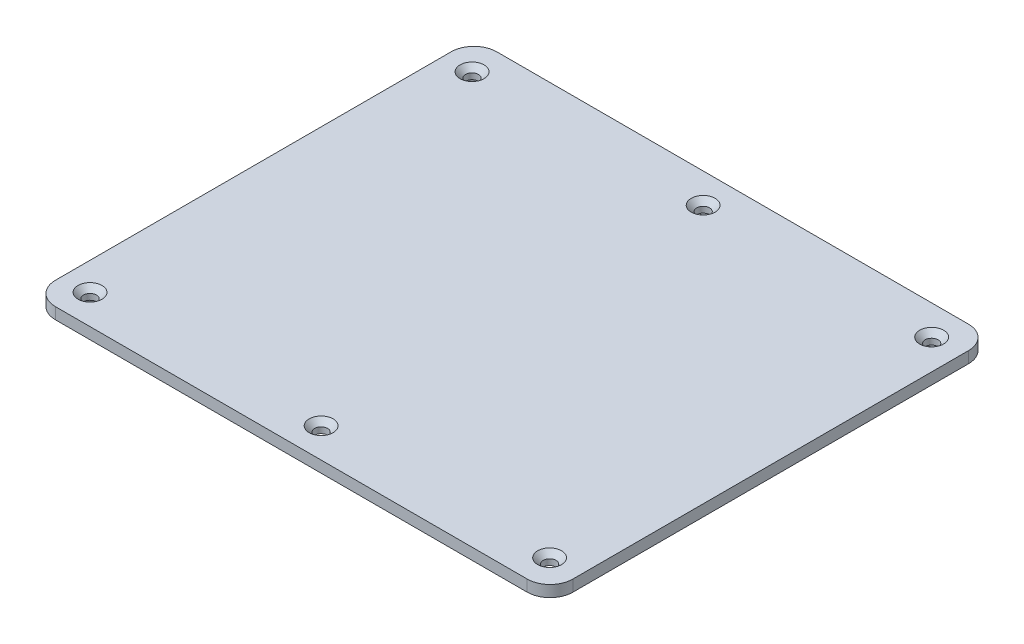
ISO-10303-21;
HEADER;
FILE_DESCRIPTION(('STEP AP214'),'2;1');
FILE_NAME('part.step','',(''),(''),'','','');
FILE_SCHEMA(('AUTOMOTIVE_DESIGN { 1 0 10303 214 1 1 1 1 }'));
ENDSEC;
DATA;
#1=APPLICATION_CONTEXT('core data for automotive mechanical design processes');
#2=APPLICATION_PROTOCOL_DEFINITION('international standard','automotive_design',2000,#1);
#3=PRODUCT_CONTEXT('',#1,'mechanical');
#4=PRODUCT('Part','Part','',(#3));
#5=PRODUCT_RELATED_PRODUCT_CATEGORY('part','',(#4));
#6=PRODUCT_DEFINITION_FORMATION('','',#4);
#7=PRODUCT_DEFINITION_CONTEXT('part definition',#1,'design');
#8=PRODUCT_DEFINITION('design','',#6,#7);
#9=PRODUCT_DEFINITION_SHAPE('','',#8);
#10=(LENGTH_UNIT() NAMED_UNIT(*) SI_UNIT(.MILLI.,.METRE.));
#11=(NAMED_UNIT(*) PLANE_ANGLE_UNIT() SI_UNIT($,.RADIAN.));
#12=(NAMED_UNIT(*) SI_UNIT($,.STERADIAN.) SOLID_ANGLE_UNIT());
#13=UNCERTAINTY_MEASURE_WITH_UNIT(LENGTH_MEASURE(1.E-05),#10,'distance_accuracy_value','');
#14=(GEOMETRIC_REPRESENTATION_CONTEXT(3) GLOBAL_UNCERTAINTY_ASSIGNED_CONTEXT((#13)) GLOBAL_UNIT_ASSIGNED_CONTEXT((#10,
#11,#12)) REPRESENTATION_CONTEXT('',''));
#15=CARTESIAN_POINT('',(0.,0.,0.));
#16=DIRECTION('',(0.,0.,1.));
#17=DIRECTION('',(1.,0.,0.));
#18=AXIS2_PLACEMENT_3D('',#15,#16,#17);
#19=CARTESIAN_POINT('',(-62.,3.,52.));
#20=DIRECTION('',(0.,-1.,0.));
#21=DIRECTION('',(0.,0.,-1.));
#22=AXIS2_PLACEMENT_3D('',#19,#20,#21);
#23=CYLINDRICAL_SURFACE('',#22,5.99999999999999);
#24=CARTESIAN_POINT('',(-62.,0.,52.));
#25=DIRECTION('',(0.,1.,0.));
#26=DIRECTION('',(0.,0.,1.));
#27=AXIS2_PLACEMENT_3D('',#24,#25,#26);
#28=CIRCLE('',#27,5.99999999999999);
#29=CARTESIAN_POINT('',(-68.,0.,52.));
#30=VERTEX_POINT('',#29);
#31=CARTESIAN_POINT('',(-62.,0.,58.));
#32=VERTEX_POINT('',#31);
#33=EDGE_CURVE('E286',#30,#32,#28,.T.);
#34=ORIENTED_EDGE('',*,*,#33,.T.);
#35=DIRECTION('',(0.,-1.,0.));
#36=VECTOR('',#35,1.);
#37=CARTESIAN_POINT('',(-62.,3.,58.));
#38=LINE('',#37,#36);
#39=CARTESIAN_POINT('',(-62.,3.,58.));
#40=VERTEX_POINT('',#39);
#41=EDGE_CURVE('E359',#40,#32,#38,.T.);
#42=ORIENTED_EDGE('',*,*,#41,.F.);
#43=CARTESIAN_POINT('',(-62.,3.,52.));
#44=DIRECTION('',(0.,1.,0.));
#45=DIRECTION('',(0.,0.,1.));
#46=AXIS2_PLACEMENT_3D('',#43,#44,#45);
#47=CIRCLE('',#46,5.99999999999999);
#48=CARTESIAN_POINT('',(-68.,3.,52.));
#49=VERTEX_POINT('',#48);
#50=EDGE_CURVE('E305',#49,#40,#47,.T.);
#51=ORIENTED_EDGE('',*,*,#50,.F.);
#52=DIRECTION('',(0.,-1.,0.));
#53=VECTOR('',#52,1.);
#54=CARTESIAN_POINT('',(-68.,3.,52.));
#55=LINE('',#54,#53);
#56=EDGE_CURVE('E323',#49,#30,#55,.T.);
#57=ORIENTED_EDGE('',*,*,#56,.T.);
#58=EDGE_LOOP('',(#34,#42,#51,#57));
#59=FACE_BOUND('',#58,.T.);
#60=ADVANCED_FACE('F33',(#59),#23,.T.);
#61=CARTESIAN_POINT('',(62.,3.,58.));
#62=DIRECTION('',(0.,0.,-1.));
#63=DIRECTION('',(-1.,0.,0.));
#64=AXIS2_PLACEMENT_3D('',#61,#62,#63);
#65=PLANE('',#64);
#66=DIRECTION('',(1.,0.,0.));
#67=VECTOR('',#66,1.);
#68=CARTESIAN_POINT('',(62.,0.,58.));
#69=LINE('',#68,#67);
#70=CARTESIAN_POINT('',(62.,0.,58.));
#71=VERTEX_POINT('',#70);
#72=EDGE_CURVE('E326',#32,#71,#69,.T.);
#73=ORIENTED_EDGE('',*,*,#72,.T.);
#74=DIRECTION('',(0.,-1.,0.));
#75=VECTOR('',#74,1.);
#76=CARTESIAN_POINT('',(62.,3.,58.));
#77=LINE('',#76,#75);
#78=CARTESIAN_POINT('',(62.,3.,58.));
#79=VERTEX_POINT('',#78);
#80=EDGE_CURVE('E356',#79,#71,#77,.T.);
#81=ORIENTED_EDGE('',*,*,#80,.F.);
#82=DIRECTION('',(1.,0.,0.));
#83=VECTOR('',#82,1.);
#84=CARTESIAN_POINT('',(62.,3.,58.));
#85=LINE('',#84,#83);
#86=EDGE_CURVE('E308',#40,#79,#85,.T.);
#87=ORIENTED_EDGE('',*,*,#86,.F.);
#88=ORIENTED_EDGE('',*,*,#41,.T.);
#89=EDGE_LOOP('',(#73,#81,#87,#88));
#90=FACE_BOUND('',#89,.T.);
#91=ADVANCED_FACE('F465',(#90),#65,.F.);
#92=CARTESIAN_POINT('',(62.,3.,52.));
#93=DIRECTION('',(0.,-1.,0.));
#94=DIRECTION('',(0.,0.,-1.));
#95=AXIS2_PLACEMENT_3D('',#92,#93,#94);
#96=CYLINDRICAL_SURFACE('',#95,6.00000000000001);
#97=CARTESIAN_POINT('',(62.,0.,52.));
#98=DIRECTION('',(0.,1.,0.));
#99=DIRECTION('',(0.,0.,1.));
#100=AXIS2_PLACEMENT_3D('',#97,#98,#99);
#101=CIRCLE('',#100,6.00000000000001);
#102=CARTESIAN_POINT('',(68.,0.,52.));
#103=VERTEX_POINT('',#102);
#104=EDGE_CURVE('E328',#71,#103,#101,.T.);
#105=ORIENTED_EDGE('',*,*,#104,.T.);
#106=DIRECTION('',(0.,-1.,0.));
#107=VECTOR('',#106,1.);
#108=CARTESIAN_POINT('',(68.,3.,52.));
#109=LINE('',#108,#107);
#110=CARTESIAN_POINT('',(68.,3.,52.));
#111=VERTEX_POINT('',#110);
#112=EDGE_CURVE('E353',#111,#103,#109,.T.);
#113=ORIENTED_EDGE('',*,*,#112,.F.);
#114=CARTESIAN_POINT('',(62.,3.,52.));
#115=DIRECTION('',(0.,1.,0.));
#116=DIRECTION('',(0.,0.,1.));
#117=AXIS2_PLACEMENT_3D('',#114,#115,#116);
#118=CIRCLE('',#117,6.00000000000001);
#119=EDGE_CURVE('E311',#79,#111,#118,.T.);
#120=ORIENTED_EDGE('',*,*,#119,.F.);
#121=ORIENTED_EDGE('',*,*,#80,.T.);
#122=EDGE_LOOP('',(#105,#113,#120,#121));
#123=FACE_BOUND('',#122,.T.);
#124=ADVANCED_FACE('F470',(#123),#96,.T.);
#125=CARTESIAN_POINT('',(68.,3.,52.));
#126=DIRECTION('',(-1.,0.,0.));
#127=DIRECTION('',(0.,0.,1.));
#128=AXIS2_PLACEMENT_3D('',#125,#126,#127);
#129=PLANE('',#128);
#130=DIRECTION('',(0.,0.,-1.));
#131=VECTOR('',#130,1.);
#132=CARTESIAN_POINT('',(68.,0.,52.));
#133=LINE('',#132,#131);
#134=CARTESIAN_POINT('',(68.,0.,-52.));
#135=VERTEX_POINT('',#134);
#136=EDGE_CURVE('E330',#103,#135,#133,.T.);
#137=ORIENTED_EDGE('',*,*,#136,.T.);
#138=DIRECTION('',(0.,-1.,0.));
#139=VECTOR('',#138,1.);
#140=CARTESIAN_POINT('',(68.,3.,-52.));
#141=LINE('',#140,#139);
#142=CARTESIAN_POINT('',(68.,3.,-52.));
#143=VERTEX_POINT('',#142);
#144=EDGE_CURVE('E350',#143,#135,#141,.T.);
#145=ORIENTED_EDGE('',*,*,#144,.F.);
#146=DIRECTION('',(0.,0.,-1.));
#147=VECTOR('',#146,1.);
#148=CARTESIAN_POINT('',(68.,3.,52.));
#149=LINE('',#148,#147);
#150=EDGE_CURVE('E313',#111,#143,#149,.T.);
#151=ORIENTED_EDGE('',*,*,#150,.F.);
#152=ORIENTED_EDGE('',*,*,#112,.T.);
#153=EDGE_LOOP('',(#137,#145,#151,#152));
#154=FACE_BOUND('',#153,.T.);
#155=ADVANCED_FACE('F506',(#154),#129,.F.);
#156=CARTESIAN_POINT('',(62.,3.,-52.));
#157=DIRECTION('',(0.,-1.,0.));
#158=DIRECTION('',(0.,0.,-1.));
#159=AXIS2_PLACEMENT_3D('',#156,#157,#158);
#160=CYLINDRICAL_SURFACE('',#159,5.99999999999999);
#161=CARTESIAN_POINT('',(62.,0.,-52.));
#162=DIRECTION('',(0.,1.,0.));
#163=DIRECTION('',(0.,0.,1.));
#164=AXIS2_PLACEMENT_3D('',#161,#162,#163);
#165=CIRCLE('',#164,5.99999999999999);
#166=CARTESIAN_POINT('',(62.,0.,-58.));
#167=VERTEX_POINT('',#166);
#168=EDGE_CURVE('E332',#135,#167,#165,.T.);
#169=ORIENTED_EDGE('',*,*,#168,.T.);
#170=DIRECTION('',(0.,-1.,0.));
#171=VECTOR('',#170,1.);
#172=CARTESIAN_POINT('',(62.,3.,-58.));
#173=LINE('',#172,#171);
#174=CARTESIAN_POINT('',(62.,3.,-58.));
#175=VERTEX_POINT('',#174);
#176=EDGE_CURVE('E347',#175,#167,#173,.T.);
#177=ORIENTED_EDGE('',*,*,#176,.F.);
#178=CARTESIAN_POINT('',(62.,3.,-52.));
#179=DIRECTION('',(0.,1.,0.));
#180=DIRECTION('',(0.,0.,1.));
#181=AXIS2_PLACEMENT_3D('',#178,#179,#180);
#182=CIRCLE('',#181,5.99999999999999);
#183=EDGE_CURVE('E315',#143,#175,#182,.T.);
#184=ORIENTED_EDGE('',*,*,#183,.F.);
#185=ORIENTED_EDGE('',*,*,#144,.T.);
#186=EDGE_LOOP('',(#169,#177,#184,#185));
#187=FACE_BOUND('',#186,.T.);
#188=ADVANCED_FACE('F502',(#187),#160,.T.);
#189=CARTESIAN_POINT('',(62.,3.,-58.));
#190=DIRECTION('',(0.,0.,1.));
#191=DIRECTION('',(1.,0.,0.));
#192=AXIS2_PLACEMENT_3D('',#189,#190,#191);
#193=PLANE('',#192);
#194=DIRECTION('',(-1.,0.,0.));
#195=VECTOR('',#194,1.);
#196=CARTESIAN_POINT('',(62.,0.,-58.));
#197=LINE('',#196,#195);
#198=CARTESIAN_POINT('',(-62.,0.,-58.));
#199=VERTEX_POINT('',#198);
#200=EDGE_CURVE('E334',#167,#199,#197,.T.);
#201=ORIENTED_EDGE('',*,*,#200,.T.);
#202=DIRECTION('',(0.,-1.,0.));
#203=VECTOR('',#202,1.);
#204=CARTESIAN_POINT('',(-62.,3.,-58.));
#205=LINE('',#204,#203);
#206=CARTESIAN_POINT('',(-62.,3.,-58.));
#207=VERTEX_POINT('',#206);
#208=EDGE_CURVE('E344',#207,#199,#205,.T.);
#209=ORIENTED_EDGE('',*,*,#208,.F.);
#210=DIRECTION('',(-1.,0.,0.));
#211=VECTOR('',#210,1.);
#212=CARTESIAN_POINT('',(62.,3.,-58.));
#213=LINE('',#212,#211);
#214=EDGE_CURVE('E317',#175,#207,#213,.T.);
#215=ORIENTED_EDGE('',*,*,#214,.F.);
#216=ORIENTED_EDGE('',*,*,#176,.T.);
#217=EDGE_LOOP('',(#201,#209,#215,#216));
#218=FACE_BOUND('',#217,.T.);
#219=ADVANCED_FACE('F497',(#218),#193,.F.);
#220=CARTESIAN_POINT('',(-62.,3.,-52.));
#221=DIRECTION('',(0.,-1.,0.));
#222=DIRECTION('',(0.,0.,-1.));
#223=AXIS2_PLACEMENT_3D('',#220,#221,#222);
#224=CYLINDRICAL_SURFACE('',#223,6.00000000000001);
#225=CARTESIAN_POINT('',(-62.,0.,-52.));
#226=DIRECTION('',(0.,1.,0.));
#227=DIRECTION('',(0.,0.,1.));
#228=AXIS2_PLACEMENT_3D('',#225,#226,#227);
#229=CIRCLE('',#228,6.00000000000001);
#230=CARTESIAN_POINT('',(-68.,0.,-52.));
#231=VERTEX_POINT('',#230);
#232=EDGE_CURVE('E336',#199,#231,#229,.T.);
#233=ORIENTED_EDGE('',*,*,#232,.T.);
#234=DIRECTION('',(0.,-1.,0.));
#235=VECTOR('',#234,1.);
#236=CARTESIAN_POINT('',(-68.,3.,-52.));
#237=LINE('',#236,#235);
#238=CARTESIAN_POINT('',(-68.,3.,-52.));
#239=VERTEX_POINT('',#238);
#240=EDGE_CURVE('E341',#239,#231,#237,.T.);
#241=ORIENTED_EDGE('',*,*,#240,.F.);
#242=CARTESIAN_POINT('',(-62.,3.,-52.));
#243=DIRECTION('',(0.,1.,0.));
#244=DIRECTION('',(0.,0.,1.));
#245=AXIS2_PLACEMENT_3D('',#242,#243,#244);
#246=CIRCLE('',#245,6.00000000000001);
#247=EDGE_CURVE('E319',#207,#239,#246,.T.);
#248=ORIENTED_EDGE('',*,*,#247,.F.);
#249=ORIENTED_EDGE('',*,*,#208,.T.);
#250=EDGE_LOOP('',(#233,#241,#248,#249));
#251=FACE_BOUND('',#250,.T.);
#252=ADVANCED_FACE('F492',(#251),#224,.T.);
#253=CARTESIAN_POINT('',(-68.,3.,52.));
#254=DIRECTION('',(1.,0.,0.));
#255=DIRECTION('',(0.,0.,-1.));
#256=AXIS2_PLACEMENT_3D('',#253,#254,#255);
#257=PLANE('',#256);
#258=DIRECTION('',(0.,0.,1.));
#259=VECTOR('',#258,1.);
#260=CARTESIAN_POINT('',(-68.,0.,52.));
#261=LINE('',#260,#259);
#262=EDGE_CURVE('E309',#231,#30,#261,.T.);
#263=ORIENTED_EDGE('',*,*,#262,.T.);
#264=ORIENTED_EDGE('',*,*,#56,.F.);
#265=DIRECTION('',(0.,0.,1.));
#266=VECTOR('',#265,1.);
#267=CARTESIAN_POINT('',(-68.,3.,52.));
#268=LINE('',#267,#266);
#269=EDGE_CURVE('E321',#239,#49,#268,.T.);
#270=ORIENTED_EDGE('',*,*,#269,.F.);
#271=ORIENTED_EDGE('',*,*,#240,.T.);
#272=EDGE_LOOP('',(#263,#264,#270,#271));
#273=FACE_BOUND('',#272,.T.);
#274=ADVANCED_FACE('F490',(#273),#257,.F.);
#275=CARTESIAN_POINT('',(-62.,3.,52.));
#276=DIRECTION('',(0.,1.,0.));
#277=DIRECTION('',(0.,0.,1.));
#278=AXIS2_PLACEMENT_3D('',#275,#276,#277);
#279=PLANE('',#278);
#280=CARTESIAN_POINT('',(-60.7,3.,-50.2));
#281=DIRECTION('',(0.,1.,0.));
#282=DIRECTION('',(0.,0.,1.));
#283=AXIS2_PLACEMENT_3D('',#280,#281,#282);
#284=CIRCLE('',#283,3.15);
#285=CARTESIAN_POINT('',(-60.7,3.,-47.05));
#286=VERTEX_POINT('',#285);
#287=EDGE_CURVE('E656',#286,#286,#284,.T.);
#288=ORIENTED_EDGE('',*,*,#287,.F.);
#289=EDGE_LOOP('',(#288));
#290=FACE_BOUND('',#289,.T.);
#291=CARTESIAN_POINT('',(0.0399999999999845,3.,-50.2));
#292=DIRECTION('',(0.,1.,0.));
#293=DIRECTION('',(0.,0.,1.));
#294=AXIS2_PLACEMENT_3D('',#291,#292,#293);
#295=CIRCLE('',#294,3.15);
#296=CARTESIAN_POINT('',(0.0399999999999845,3.,-47.05));
#297=VERTEX_POINT('',#296);
#298=EDGE_CURVE('E425',#297,#297,#295,.T.);
#299=ORIENTED_EDGE('',*,*,#298,.F.);
#300=EDGE_LOOP('',(#299));
#301=FACE_BOUND('',#300,.T.);
#302=CARTESIAN_POINT('',(0.0399999999999845,3.,50.2));
#303=DIRECTION('',(0.,1.,0.));
#304=DIRECTION('',(0.,0.,1.));
#305=AXIS2_PLACEMENT_3D('',#302,#303,#304);
#306=CIRCLE('',#305,3.15);
#307=CARTESIAN_POINT('',(0.0399999999999845,3.,53.35));
#308=VERTEX_POINT('',#307);
#309=EDGE_CURVE('E418',#308,#308,#306,.T.);
#310=ORIENTED_EDGE('',*,*,#309,.F.);
#311=EDGE_LOOP('',(#310));
#312=FACE_BOUND('',#311,.T.);
#313=CARTESIAN_POINT('',(60.09,3.,50.2));
#314=DIRECTION('',(0.,1.,0.));
#315=DIRECTION('',(0.,0.,1.));
#316=AXIS2_PLACEMENT_3D('',#313,#314,#315);
#317=CIRCLE('',#316,3.14999999999999);
#318=CARTESIAN_POINT('',(60.09,3.,53.35));
#319=VERTEX_POINT('',#318);
#320=EDGE_CURVE('E414',#319,#319,#317,.T.);
#321=ORIENTED_EDGE('',*,*,#320,.F.);
#322=EDGE_LOOP('',(#321));
#323=FACE_BOUND('',#322,.T.);
#324=CARTESIAN_POINT('',(-60.7,3.,50.2));
#325=DIRECTION('',(0.,1.,0.));
#326=DIRECTION('',(0.,0.,1.));
#327=AXIS2_PLACEMENT_3D('',#324,#325,#326);
#328=CIRCLE('',#327,3.15);
#329=CARTESIAN_POINT('',(-60.7,3.,53.35));
#330=VERTEX_POINT('',#329);
#331=EDGE_CURVE('E410',#330,#330,#328,.T.);
#332=ORIENTED_EDGE('',*,*,#331,.F.);
#333=EDGE_LOOP('',(#332));
#334=FACE_BOUND('',#333,.T.);
#335=CARTESIAN_POINT('',(60.09,3.,-50.2));
#336=DIRECTION('',(0.,1.,0.));
#337=DIRECTION('',(0.,0.,1.));
#338=AXIS2_PLACEMENT_3D('',#335,#336,#337);
#339=CIRCLE('',#338,3.15);
#340=CARTESIAN_POINT('',(60.09,3.,-47.05));
#341=VERTEX_POINT('',#340);
#342=EDGE_CURVE('E405',#341,#341,#339,.T.);
#343=ORIENTED_EDGE('',*,*,#342,.F.);
#344=EDGE_LOOP('',(#343));
#345=FACE_BOUND('',#344,.T.);
#346=ORIENTED_EDGE('',*,*,#50,.T.);
#347=ORIENTED_EDGE('',*,*,#86,.T.);
#348=ORIENTED_EDGE('',*,*,#119,.T.);
#349=ORIENTED_EDGE('',*,*,#150,.T.);
#350=ORIENTED_EDGE('',*,*,#183,.T.);
#351=ORIENTED_EDGE('',*,*,#214,.T.);
#352=ORIENTED_EDGE('',*,*,#247,.T.);
#353=ORIENTED_EDGE('',*,*,#269,.T.);
#354=EDGE_LOOP('',(#346,#347,#348,#349,#350,#351,#352,#353));
#355=FACE_BOUND('',#354,.T.);
#356=ADVANCED_FACE('F485',(#290,#301,#312,#323,#334,#345,#355),#279,.T.);
#357=CARTESIAN_POINT('',(-62.,0.,52.));
#358=DIRECTION('',(0.,1.,0.));
#359=DIRECTION('',(0.,0.,1.));
#360=AXIS2_PLACEMENT_3D('',#357,#358,#359);
#361=PLANE('',#360);
#362=DIRECTION('',(0.,0.,1.));
#363=VECTOR('',#362,1.);
#364=CARTESIAN_POINT('',(-64.84,0.,52.));
#365=LINE('',#364,#363);
#366=CARTESIAN_POINT('',(-64.84,0.,-51.84));
#367=VERTEX_POINT('',#366);
#368=CARTESIAN_POINT('',(-64.84,0.,51.84));
#369=VERTEX_POINT('',#368);
#370=EDGE_CURVE('E41',#367,#369,#365,.T.);
#371=ORIENTED_EDGE('',*,*,#370,.T.);
#372=CARTESIAN_POINT('',(-61.84,0.,51.84));
#373=DIRECTION('',(0.,1.,0.));
#374=DIRECTION('',(0.,0.,1.));
#375=AXIS2_PLACEMENT_3D('',#372,#373,#374);
#376=CIRCLE('',#375,3.);
#377=CARTESIAN_POINT('',(-61.84,0.,54.84));
#378=VERTEX_POINT('',#377);
#379=EDGE_CURVE('E11',#369,#378,#376,.T.);
#380=ORIENTED_EDGE('',*,*,#379,.T.);
#381=DIRECTION('',(1.,0.,0.));
#382=VECTOR('',#381,1.);
#383=CARTESIAN_POINT('',(-62.,0.,54.84));
#384=LINE('',#383,#382);
#385=CARTESIAN_POINT('',(61.84,0.,54.84));
#386=VERTEX_POINT('',#385);
#387=EDGE_CURVE('E382',#378,#386,#384,.T.);
#388=ORIENTED_EDGE('',*,*,#387,.T.);
#389=CARTESIAN_POINT('',(61.84,0.,51.84));
#390=DIRECTION('',(0.,1.,0.));
#391=DIRECTION('',(0.,0.,1.));
#392=AXIS2_PLACEMENT_3D('',#389,#390,#391);
#393=CIRCLE('',#392,3.00000000000001);
#394=CARTESIAN_POINT('',(64.84,0.,51.84));
#395=VERTEX_POINT('',#394);
#396=EDGE_CURVE('E385',#386,#395,#393,.T.);
#397=ORIENTED_EDGE('',*,*,#396,.T.);
#398=DIRECTION('',(0.,0.,-1.));
#399=VECTOR('',#398,1.);
#400=CARTESIAN_POINT('',(64.8400000000001,0.,52.));
#401=LINE('',#400,#399);
#402=CARTESIAN_POINT('',(64.84,0.,-51.84));
#403=VERTEX_POINT('',#402);
#404=EDGE_CURVE('E388',#395,#403,#401,.T.);
#405=ORIENTED_EDGE('',*,*,#404,.T.);
#406=CARTESIAN_POINT('',(61.84,0.,-51.84));
#407=DIRECTION('',(0.,1.,0.));
#408=DIRECTION('',(0.,0.,1.));
#409=AXIS2_PLACEMENT_3D('',#406,#407,#408);
#410=CIRCLE('',#409,3.00000000000001);
#411=CARTESIAN_POINT('',(61.84,0.,-54.84));
#412=VERTEX_POINT('',#411);
#413=EDGE_CURVE('E391',#403,#412,#410,.T.);
#414=ORIENTED_EDGE('',*,*,#413,.T.);
#415=DIRECTION('',(-1.,0.,0.));
#416=VECTOR('',#415,1.);
#417=CARTESIAN_POINT('',(-62.,0.,-54.84));
#418=LINE('',#417,#416);
#419=CARTESIAN_POINT('',(-61.84,0.,-54.84));
#420=VERTEX_POINT('',#419);
#421=EDGE_CURVE('E394',#412,#420,#418,.T.);
#422=ORIENTED_EDGE('',*,*,#421,.T.);
#423=CARTESIAN_POINT('',(-61.84,0.,-51.84));
#424=DIRECTION('',(0.,1.,0.));
#425=DIRECTION('',(0.,0.,1.));
#426=AXIS2_PLACEMENT_3D('',#423,#424,#425);
#427=CIRCLE('',#426,3.);
#428=EDGE_CURVE('E397',#420,#367,#427,.T.);
#429=ORIENTED_EDGE('',*,*,#428,.T.);
#430=EDGE_LOOP('',(#371,#380,#388,#397,#405,#414,#422,#429));
#431=FACE_BOUND('',#430,.T.);
#432=ORIENTED_EDGE('',*,*,#33,.F.);
#433=ORIENTED_EDGE('',*,*,#262,.F.);
#434=ORIENTED_EDGE('',*,*,#232,.F.);
#435=ORIENTED_EDGE('',*,*,#200,.F.);
#436=ORIENTED_EDGE('',*,*,#168,.F.);
#437=ORIENTED_EDGE('',*,*,#136,.F.);
#438=ORIENTED_EDGE('',*,*,#104,.F.);
#439=ORIENTED_EDGE('',*,*,#72,.F.);
#440=EDGE_LOOP('',(#432,#433,#434,#435,#436,#437,#438,#439));
#441=FACE_BOUND('',#440,.T.);
#442=ADVANCED_FACE('F478',(#431,#441),#361,.F.);
#443=CARTESIAN_POINT('',(-61.84,-2.,51.84));
#444=DIRECTION('',(0.,1.,0.));
#445=DIRECTION('',(0.,0.,1.));
#446=AXIS2_PLACEMENT_3D('',#443,#444,#445);
#447=CYLINDRICAL_SURFACE('',#446,3.);
#448=ORIENTED_EDGE('',*,*,#379,.F.);
#449=DIRECTION('',(0.,1.,0.));
#450=VECTOR('',#449,1.);
#451=CARTESIAN_POINT('',(-64.84,-2.,51.84));
#452=LINE('',#451,#450);
#453=CARTESIAN_POINT('',(-64.84,-2.,51.84));
#454=VERTEX_POINT('',#453);
#455=EDGE_CURVE('E283',#454,#369,#452,.T.);
#456=ORIENTED_EDGE('',*,*,#455,.F.);
#457=CARTESIAN_POINT('',(-61.84,-2.,51.84));
#458=DIRECTION('',(0.,1.,0.));
#459=DIRECTION('',(0.,0.,1.));
#460=AXIS2_PLACEMENT_3D('',#457,#458,#459);
#461=CIRCLE('',#460,3.);
#462=CARTESIAN_POINT('',(-61.84,-2.,54.84));
#463=VERTEX_POINT('',#462);
#464=EDGE_CURVE('E243',#454,#463,#461,.T.);
#465=ORIENTED_EDGE('',*,*,#464,.T.);
#466=DIRECTION('',(0.,1.,0.));
#467=VECTOR('',#466,1.);
#468=CARTESIAN_POINT('',(-61.84,-2.,54.84));
#469=LINE('',#468,#467);
#470=EDGE_CURVE('E282',#463,#378,#469,.T.);
#471=ORIENTED_EDGE('',*,*,#470,.T.);
#472=EDGE_LOOP('',(#448,#456,#465,#471));
#473=FACE_BOUND('',#472,.T.);
#474=ADVANCED_FACE('F526',(#473),#447,.T.);
#475=CARTESIAN_POINT('',(-64.84,-2.,-51.84));
#476=DIRECTION('',(-1.,0.,0.));
#477=DIRECTION('',(0.,0.,1.));
#478=AXIS2_PLACEMENT_3D('',#475,#476,#477);
#479=PLANE('',#478);
#480=ORIENTED_EDGE('',*,*,#370,.F.);
#481=DIRECTION('',(0.,1.,0.));
#482=VECTOR('',#481,1.);
#483=CARTESIAN_POINT('',(-64.84,-2.,-51.84));
#484=LINE('',#483,#482);
#485=CARTESIAN_POINT('',(-64.84,-2.,-51.84));
#486=VERTEX_POINT('',#485);
#487=EDGE_CURVE('E287',#486,#367,#484,.T.);
#488=ORIENTED_EDGE('',*,*,#487,.F.);
#489=DIRECTION('',(0.,0.,1.));
#490=VECTOR('',#489,1.);
#491=CARTESIAN_POINT('',(-64.84,-2.,-51.84));
#492=LINE('',#491,#490);
#493=EDGE_CURVE('E279',#486,#454,#492,.T.);
#494=ORIENTED_EDGE('',*,*,#493,.T.);
#495=ORIENTED_EDGE('',*,*,#455,.T.);
#496=EDGE_LOOP('',(#480,#488,#494,#495));
#497=FACE_BOUND('',#496,.T.);
#498=ADVANCED_FACE('F533',(#497),#479,.T.);
#499=CARTESIAN_POINT('',(-61.84,-2.,-51.84));
#500=DIRECTION('',(0.,1.,0.));
#501=DIRECTION('',(0.,0.,1.));
#502=AXIS2_PLACEMENT_3D('',#499,#500,#501);
#503=CYLINDRICAL_SURFACE('',#502,3.);
#504=ORIENTED_EDGE('',*,*,#428,.F.);
#505=DIRECTION('',(0.,1.,0.));
#506=VECTOR('',#505,1.);
#507=CARTESIAN_POINT('',(-61.84,-2.,-54.84));
#508=LINE('',#507,#506);
#509=CARTESIAN_POINT('',(-61.84,-2.,-54.84));
#510=VERTEX_POINT('',#509);
#511=EDGE_CURVE('E290',#510,#420,#508,.T.);
#512=ORIENTED_EDGE('',*,*,#511,.F.);
#513=CARTESIAN_POINT('',(-61.84,-2.,-51.84));
#514=DIRECTION('',(0.,1.,0.));
#515=DIRECTION('',(0.,0.,1.));
#516=AXIS2_PLACEMENT_3D('',#513,#514,#515);
#517=CIRCLE('',#516,3.);
#518=EDGE_CURVE('E276',#510,#486,#517,.T.);
#519=ORIENTED_EDGE('',*,*,#518,.T.);
#520=ORIENTED_EDGE('',*,*,#487,.T.);
#521=EDGE_LOOP('',(#504,#512,#519,#520));
#522=FACE_BOUND('',#521,.T.);
#523=ADVANCED_FACE('F553',(#522),#503,.T.);
#524=CARTESIAN_POINT('',(-61.84,-2.,-54.84));
#525=DIRECTION('',(0.,0.,-1.));
#526=DIRECTION('',(-1.,0.,0.));
#527=AXIS2_PLACEMENT_3D('',#524,#525,#526);
#528=PLANE('',#527);
#529=ORIENTED_EDGE('',*,*,#421,.F.);
#530=DIRECTION('',(0.,1.,0.));
#531=VECTOR('',#530,1.);
#532=CARTESIAN_POINT('',(61.84,-2.,-54.84));
#533=LINE('',#532,#531);
#534=CARTESIAN_POINT('',(61.84,-2.,-54.84));
#535=VERTEX_POINT('',#534);
#536=EDGE_CURVE('E293',#535,#412,#533,.T.);
#537=ORIENTED_EDGE('',*,*,#536,.F.);
#538=DIRECTION('',(-1.,0.,0.));
#539=VECTOR('',#538,1.);
#540=CARTESIAN_POINT('',(-61.84,-2.,-54.84));
#541=LINE('',#540,#539);
#542=EDGE_CURVE('E273',#535,#510,#541,.T.);
#543=ORIENTED_EDGE('',*,*,#542,.T.);
#544=ORIENTED_EDGE('',*,*,#511,.T.);
#545=EDGE_LOOP('',(#529,#537,#543,#544));
#546=FACE_BOUND('',#545,.T.);
#547=ADVANCED_FACE('F549',(#546),#528,.T.);
#548=CARTESIAN_POINT('',(61.84,-2.,-51.84));
#549=DIRECTION('',(0.,1.,0.));
#550=DIRECTION('',(0.,0.,1.));
#551=AXIS2_PLACEMENT_3D('',#548,#549,#550);
#552=CYLINDRICAL_SURFACE('',#551,3.00000000000001);
#553=ORIENTED_EDGE('',*,*,#413,.F.);
#554=DIRECTION('',(0.,1.,0.));
#555=VECTOR('',#554,1.);
#556=CARTESIAN_POINT('',(64.84,-2.,-51.84));
#557=LINE('',#556,#555);
#558=CARTESIAN_POINT('',(64.84,-2.,-51.84));
#559=VERTEX_POINT('',#558);
#560=EDGE_CURVE('E296',#559,#403,#557,.T.);
#561=ORIENTED_EDGE('',*,*,#560,.F.);
#562=CARTESIAN_POINT('',(61.84,-2.,-51.84));
#563=DIRECTION('',(0.,1.,0.));
#564=DIRECTION('',(0.,0.,-1.));
#565=AXIS2_PLACEMENT_3D('',#562,#563,#564);
#566=CIRCLE('',#565,3.00000000000001);
#567=EDGE_CURVE('E270',#559,#535,#566,.T.);
#568=ORIENTED_EDGE('',*,*,#567,.T.);
#569=ORIENTED_EDGE('',*,*,#536,.T.);
#570=EDGE_LOOP('',(#553,#561,#568,#569));
#571=FACE_BOUND('',#570,.T.);
#572=ADVANCED_FACE('F545',(#571),#552,.T.);
#573=CARTESIAN_POINT('',(64.84,-2.,-51.84));
#574=DIRECTION('',(1.,0.,0.));
#575=DIRECTION('',(0.,0.,-1.));
#576=AXIS2_PLACEMENT_3D('',#573,#574,#575);
#577=PLANE('',#576);
#578=ORIENTED_EDGE('',*,*,#404,.F.);
#579=DIRECTION('',(0.,1.,0.));
#580=VECTOR('',#579,1.);
#581=CARTESIAN_POINT('',(64.84,-2.,51.84));
#582=LINE('',#581,#580);
#583=CARTESIAN_POINT('',(64.84,-2.,51.84));
#584=VERTEX_POINT('',#583);
#585=EDGE_CURVE('E299',#584,#395,#582,.T.);
#586=ORIENTED_EDGE('',*,*,#585,.F.);
#587=DIRECTION('',(0.,0.,-1.));
#588=VECTOR('',#587,1.);
#589=CARTESIAN_POINT('',(64.84,-2.,-51.84));
#590=LINE('',#589,#588);
#591=EDGE_CURVE('E267',#584,#559,#590,.T.);
#592=ORIENTED_EDGE('',*,*,#591,.T.);
#593=ORIENTED_EDGE('',*,*,#560,.T.);
#594=EDGE_LOOP('',(#578,#586,#592,#593));
#595=FACE_BOUND('',#594,.T.);
#596=ADVANCED_FACE('F541',(#595),#577,.T.);
#597=CARTESIAN_POINT('',(61.84,-2.,51.84));
#598=DIRECTION('',(0.,1.,0.));
#599=DIRECTION('',(0.,0.,1.));
#600=AXIS2_PLACEMENT_3D('',#597,#598,#599);
#601=CYLINDRICAL_SURFACE('',#600,3.00000000000001);
#602=ORIENTED_EDGE('',*,*,#396,.F.);
#603=DIRECTION('',(0.,1.,0.));
#604=VECTOR('',#603,1.);
#605=CARTESIAN_POINT('',(61.84,-2.,54.84));
#606=LINE('',#605,#604);
#607=CARTESIAN_POINT('',(61.84,-2.,54.84));
#608=VERTEX_POINT('',#607);
#609=EDGE_CURVE('E49',#608,#386,#606,.T.);
#610=ORIENTED_EDGE('',*,*,#609,.F.);
#611=CARTESIAN_POINT('',(61.84,-2.,51.84));
#612=DIRECTION('',(0.,1.,0.));
#613=DIRECTION('',(0.,0.,1.));
#614=AXIS2_PLACEMENT_3D('',#611,#612,#613);
#615=CIRCLE('',#614,3.00000000000001);
#616=EDGE_CURVE('E264',#608,#584,#615,.T.);
#617=ORIENTED_EDGE('',*,*,#616,.T.);
#618=ORIENTED_EDGE('',*,*,#585,.T.);
#619=EDGE_LOOP('',(#602,#610,#617,#618));
#620=FACE_BOUND('',#619,.T.);
#621=ADVANCED_FACE('F538',(#620),#601,.T.);
#622=CARTESIAN_POINT('',(-61.84,-2.,54.84));
#623=DIRECTION('',(0.,0.,1.));
#624=DIRECTION('',(1.,0.,0.));
#625=AXIS2_PLACEMENT_3D('',#622,#623,#624);
#626=PLANE('',#625);
#627=ORIENTED_EDGE('',*,*,#387,.F.);
#628=ORIENTED_EDGE('',*,*,#470,.F.);
#629=DIRECTION('',(1.,0.,0.));
#630=VECTOR('',#629,1.);
#631=CARTESIAN_POINT('',(-61.84,-2.,54.84));
#632=LINE('',#631,#630);
#633=EDGE_CURVE('E262',#463,#608,#632,.T.);
#634=ORIENTED_EDGE('',*,*,#633,.T.);
#635=ORIENTED_EDGE('',*,*,#609,.T.);
#636=EDGE_LOOP('',(#627,#628,#634,#635));
#637=FACE_BOUND('',#636,.T.);
#638=ADVANCED_FACE('F535',(#637),#626,.T.);
#639=CARTESIAN_POINT('',(-59.84,-2.,49.84));
#640=DIRECTION('',(0.,1.,0.));
#641=DIRECTION('',(0.,0.,1.));
#642=AXIS2_PLACEMENT_3D('',#639,#640,#641);
#643=CYLINDRICAL_SURFACE('',#642,3.);
#644=DIRECTION('',(0.,1.,0.));
#645=VECTOR('',#644,1.);
#646=CARTESIAN_POINT('',(-62.84,-2.,49.84));
#647=LINE('',#646,#645);
#648=CARTESIAN_POINT('',(-62.84,-2.,49.84));
#649=VERTEX_POINT('',#648);
#650=CARTESIAN_POINT('',(-62.84,0.,49.84));
#651=VERTEX_POINT('',#650);
#652=EDGE_CURVE('E241',#649,#651,#647,.T.);
#653=ORIENTED_EDGE('',*,*,#652,.T.);
#654=CARTESIAN_POINT('',(-59.84,0.,49.84));
#655=DIRECTION('',(0.,1.,0.));
#656=DIRECTION('',(0.,0.,1.));
#657=AXIS2_PLACEMENT_3D('',#654,#655,#656);
#658=CIRCLE('',#657,3.);
#659=CARTESIAN_POINT('',(-59.84,0.,52.84));
#660=VERTEX_POINT('',#659);
#661=EDGE_CURVE('E57',#651,#660,#658,.T.);
#662=ORIENTED_EDGE('',*,*,#661,.T.);
#663=DIRECTION('',(0.,1.,0.));
#664=VECTOR('',#663,1.);
#665=CARTESIAN_POINT('',(-59.84,-2.,52.84));
#666=LINE('',#665,#664);
#667=CARTESIAN_POINT('',(-59.84,-2.,52.84));
#668=VERTEX_POINT('',#667);
#669=EDGE_CURVE('E195',#668,#660,#666,.T.);
#670=ORIENTED_EDGE('',*,*,#669,.F.);
#671=CARTESIAN_POINT('',(-59.84,-2.,49.84));
#672=DIRECTION('',(0.,1.,0.));
#673=DIRECTION('',(0.,0.,1.));
#674=AXIS2_PLACEMENT_3D('',#671,#672,#673);
#675=CIRCLE('',#674,3.);
#676=EDGE_CURVE('E200',#649,#668,#675,.T.);
#677=ORIENTED_EDGE('',*,*,#676,.F.);
#678=EDGE_LOOP('',(#653,#662,#670,#677));
#679=FACE_BOUND('',#678,.T.);
#680=ADVANCED_FACE('F198',(#679),#643,.F.);
#681=CARTESIAN_POINT('',(-62.84,-2.,-49.84));
#682=DIRECTION('',(-1.,0.,0.));
#683=DIRECTION('',(0.,0.,1.));
#684=AXIS2_PLACEMENT_3D('',#681,#682,#683);
#685=PLANE('',#684);
#686=DIRECTION('',(0.,1.,0.));
#687=VECTOR('',#686,1.);
#688=CARTESIAN_POINT('',(-62.84,-2.,-49.84));
#689=LINE('',#688,#687);
#690=CARTESIAN_POINT('',(-62.84,-2.,-49.84));
#691=VERTEX_POINT('',#690);
#692=CARTESIAN_POINT('',(-62.84,0.,-49.84));
#693=VERTEX_POINT('',#692);
#694=EDGE_CURVE('E244',#691,#693,#689,.T.);
#695=ORIENTED_EDGE('',*,*,#694,.T.);
#696=DIRECTION('',(0.,0.,1.));
#697=VECTOR('',#696,1.);
#698=CARTESIAN_POINT('',(-62.84,0.,52.));
#699=LINE('',#698,#697);
#700=EDGE_CURVE('E379',#693,#651,#699,.T.);
#701=ORIENTED_EDGE('',*,*,#700,.T.);
#702=ORIENTED_EDGE('',*,*,#652,.F.);
#703=DIRECTION('',(0.,0.,1.));
#704=VECTOR('',#703,1.);
#705=CARTESIAN_POINT('',(-62.84,-2.,-49.84));
#706=LINE('',#705,#704);
#707=EDGE_CURVE('E205',#691,#649,#706,.T.);
#708=ORIENTED_EDGE('',*,*,#707,.F.);
#709=EDGE_LOOP('',(#695,#701,#702,#708));
#710=FACE_BOUND('',#709,.T.);
#711=ADVANCED_FACE('F565',(#710),#685,.F.);
#712=CARTESIAN_POINT('',(-59.84,-2.,-49.84));
#713=DIRECTION('',(0.,1.,0.));
#714=DIRECTION('',(0.,0.,1.));
#715=AXIS2_PLACEMENT_3D('',#712,#713,#714);
#716=CYLINDRICAL_SURFACE('',#715,3.);
#717=DIRECTION('',(0.,1.,0.));
#718=VECTOR('',#717,1.);
#719=CARTESIAN_POINT('',(-59.84,-2.,-52.84));
#720=LINE('',#719,#718);
#721=CARTESIAN_POINT('',(-59.84,-2.,-52.84));
#722=VERTEX_POINT('',#721);
#723=CARTESIAN_POINT('',(-59.84,0.,-52.84));
#724=VERTEX_POINT('',#723);
#725=EDGE_CURVE('E247',#722,#724,#720,.T.);
#726=ORIENTED_EDGE('',*,*,#725,.T.);
#727=CARTESIAN_POINT('',(-59.84,0.,-49.84));
#728=DIRECTION('',(0.,1.,0.));
#729=DIRECTION('',(0.,0.,1.));
#730=AXIS2_PLACEMENT_3D('',#727,#728,#729);
#731=CIRCLE('',#730,3.);
#732=EDGE_CURVE('E376',#724,#693,#731,.T.);
#733=ORIENTED_EDGE('',*,*,#732,.T.);
#734=ORIENTED_EDGE('',*,*,#694,.F.);
#735=CARTESIAN_POINT('',(-59.84,-2.,-49.84));
#736=DIRECTION('',(0.,1.,0.));
#737=DIRECTION('',(0.,0.,-1.));
#738=AXIS2_PLACEMENT_3D('',#735,#736,#737);
#739=CIRCLE('',#738,3.);
#740=EDGE_CURVE('E238',#722,#691,#739,.T.);
#741=ORIENTED_EDGE('',*,*,#740,.F.);
#742=EDGE_LOOP('',(#726,#733,#734,#741));
#743=FACE_BOUND('',#742,.T.);
#744=ADVANCED_FACE('F583',(#743),#716,.F.);
#745=CARTESIAN_POINT('',(-59.84,-2.,-52.84));
#746=DIRECTION('',(0.,0.,-1.));
#747=DIRECTION('',(-1.,0.,0.));
#748=AXIS2_PLACEMENT_3D('',#745,#746,#747);
#749=PLANE('',#748);
#750=DIRECTION('',(0.,1.,0.));
#751=VECTOR('',#750,1.);
#752=CARTESIAN_POINT('',(59.84,-2.,-52.84));
#753=LINE('',#752,#751);
#754=CARTESIAN_POINT('',(59.84,-2.,-52.84));
#755=VERTEX_POINT('',#754);
#756=CARTESIAN_POINT('',(59.84,0.,-52.84));
#757=VERTEX_POINT('',#756);
#758=EDGE_CURVE('E250',#755,#757,#753,.T.);
#759=ORIENTED_EDGE('',*,*,#758,.T.);
#760=DIRECTION('',(-1.,0.,0.));
#761=VECTOR('',#760,1.);
#762=CARTESIAN_POINT('',(-62.,0.,-52.84));
#763=LINE('',#762,#761);
#764=EDGE_CURVE('E373',#757,#724,#763,.T.);
#765=ORIENTED_EDGE('',*,*,#764,.T.);
#766=ORIENTED_EDGE('',*,*,#725,.F.);
#767=DIRECTION('',(-1.,0.,0.));
#768=VECTOR('',#767,1.);
#769=CARTESIAN_POINT('',(-59.84,-2.,-52.84));
#770=LINE('',#769,#768);
#771=EDGE_CURVE('E235',#755,#722,#770,.T.);
#772=ORIENTED_EDGE('',*,*,#771,.F.);
#773=EDGE_LOOP('',(#759,#765,#766,#772));
#774=FACE_BOUND('',#773,.T.);
#775=ADVANCED_FACE('F579',(#774),#749,.F.);
#776=CARTESIAN_POINT('',(59.84,-2.,-49.84));
#777=DIRECTION('',(0.,1.,0.));
#778=DIRECTION('',(0.,0.,1.));
#779=AXIS2_PLACEMENT_3D('',#776,#777,#778);
#780=CYLINDRICAL_SURFACE('',#779,3.);
#781=DIRECTION('',(0.,1.,0.));
#782=VECTOR('',#781,1.);
#783=CARTESIAN_POINT('',(62.84,-2.,-49.84));
#784=LINE('',#783,#782);
#785=CARTESIAN_POINT('',(62.84,-2.,-49.84));
#786=VERTEX_POINT('',#785);
#787=CARTESIAN_POINT('',(62.84,0.,-49.84));
#788=VERTEX_POINT('',#787);
#789=EDGE_CURVE('E253',#786,#788,#784,.T.);
#790=ORIENTED_EDGE('',*,*,#789,.T.);
#791=CARTESIAN_POINT('',(59.84,0.,-49.84));
#792=DIRECTION('',(0.,1.,0.));
#793=DIRECTION('',(0.,0.,1.));
#794=AXIS2_PLACEMENT_3D('',#791,#792,#793);
#795=CIRCLE('',#794,3.);
#796=EDGE_CURVE('E370',#788,#757,#795,.T.);
#797=ORIENTED_EDGE('',*,*,#796,.T.);
#798=ORIENTED_EDGE('',*,*,#758,.F.);
#799=CARTESIAN_POINT('',(59.84,-2.,-49.84));
#800=DIRECTION('',(0.,1.,0.));
#801=DIRECTION('',(0.,0.,1.));
#802=AXIS2_PLACEMENT_3D('',#799,#800,#801);
#803=CIRCLE('',#802,3.);
#804=EDGE_CURVE('E232',#786,#755,#803,.T.);
#805=ORIENTED_EDGE('',*,*,#804,.F.);
#806=EDGE_LOOP('',(#790,#797,#798,#805));
#807=FACE_BOUND('',#806,.T.);
#808=ADVANCED_FACE('F575',(#807),#780,.F.);
#809=CARTESIAN_POINT('',(62.84,-2.,-49.84));
#810=DIRECTION('',(1.,0.,0.));
#811=DIRECTION('',(0.,0.,-1.));
#812=AXIS2_PLACEMENT_3D('',#809,#810,#811);
#813=PLANE('',#812);
#814=DIRECTION('',(0.,1.,0.));
#815=VECTOR('',#814,1.);
#816=CARTESIAN_POINT('',(62.84,-2.,49.84));
#817=LINE('',#816,#815);
#818=CARTESIAN_POINT('',(62.84,-2.,49.84));
#819=VERTEX_POINT('',#818);
#820=CARTESIAN_POINT('',(62.84,0.,49.84));
#821=VERTEX_POINT('',#820);
#822=EDGE_CURVE('E256',#819,#821,#817,.T.);
#823=ORIENTED_EDGE('',*,*,#822,.T.);
#824=DIRECTION('',(0.,0.,-1.));
#825=VECTOR('',#824,1.);
#826=CARTESIAN_POINT('',(62.8400000000001,0.,52.));
#827=LINE('',#826,#825);
#828=EDGE_CURVE('E367',#821,#788,#827,.T.);
#829=ORIENTED_EDGE('',*,*,#828,.T.);
#830=ORIENTED_EDGE('',*,*,#789,.F.);
#831=DIRECTION('',(0.,0.,-1.));
#832=VECTOR('',#831,1.);
#833=CARTESIAN_POINT('',(62.84,-2.,-49.84));
#834=LINE('',#833,#832);
#835=EDGE_CURVE('E229',#819,#786,#834,.T.);
#836=ORIENTED_EDGE('',*,*,#835,.F.);
#837=EDGE_LOOP('',(#823,#829,#830,#836));
#838=FACE_BOUND('',#837,.T.);
#839=ADVANCED_FACE('F571',(#838),#813,.F.);
#840=CARTESIAN_POINT('',(59.84,-2.,49.84));
#841=DIRECTION('',(0.,1.,0.));
#842=DIRECTION('',(0.,0.,1.));
#843=AXIS2_PLACEMENT_3D('',#840,#841,#842);
#844=CYLINDRICAL_SURFACE('',#843,3.00000000000001);
#845=DIRECTION('',(0.,1.,0.));
#846=VECTOR('',#845,1.);
#847=CARTESIAN_POINT('',(59.84,-2.,52.84));
#848=LINE('',#847,#846);
#849=CARTESIAN_POINT('',(59.84,-2.,52.84));
#850=VERTEX_POINT('',#849);
#851=CARTESIAN_POINT('',(59.84,0.,52.84));
#852=VERTEX_POINT('',#851);
#853=EDGE_CURVE('E204',#850,#852,#848,.T.);
#854=ORIENTED_EDGE('',*,*,#853,.T.);
#855=CARTESIAN_POINT('',(59.84,0.,49.84));
#856=DIRECTION('',(0.,1.,0.));
#857=DIRECTION('',(0.,0.,1.));
#858=AXIS2_PLACEMENT_3D('',#855,#856,#857);
#859=CIRCLE('',#858,3.00000000000001);
#860=EDGE_CURVE('E364',#852,#821,#859,.T.);
#861=ORIENTED_EDGE('',*,*,#860,.T.);
#862=ORIENTED_EDGE('',*,*,#822,.F.);
#863=CARTESIAN_POINT('',(59.84,-2.,49.84));
#864=DIRECTION('',(0.,1.,0.));
#865=DIRECTION('',(0.,0.,1.));
#866=AXIS2_PLACEMENT_3D('',#863,#864,#865);
#867=CIRCLE('',#866,3.00000000000001);
#868=EDGE_CURVE('E214',#850,#819,#867,.T.);
#869=ORIENTED_EDGE('',*,*,#868,.F.);
#870=EDGE_LOOP('',(#854,#861,#862,#869));
#871=FACE_BOUND('',#870,.T.);
#872=ADVANCED_FACE('F568',(#871),#844,.F.);
#873=CARTESIAN_POINT('',(-59.84,-2.,52.84));
#874=DIRECTION('',(0.,0.,1.));
#875=DIRECTION('',(1.,0.,0.));
#876=AXIS2_PLACEMENT_3D('',#873,#874,#875);
#877=PLANE('',#876);
#878=ORIENTED_EDGE('',*,*,#669,.T.);
#879=DIRECTION('',(1.,0.,0.));
#880=VECTOR('',#879,1.);
#881=CARTESIAN_POINT('',(-62.,0.,52.84));
#882=LINE('',#881,#880);
#883=EDGE_CURVE('E362',#660,#852,#882,.T.);
#884=ORIENTED_EDGE('',*,*,#883,.T.);
#885=ORIENTED_EDGE('',*,*,#853,.F.);
#886=DIRECTION('',(1.,0.,0.));
#887=VECTOR('',#886,1.);
#888=CARTESIAN_POINT('',(-59.84,-2.,52.84));
#889=LINE('',#888,#887);
#890=EDGE_CURVE('E209',#668,#850,#889,.T.);
#891=ORIENTED_EDGE('',*,*,#890,.F.);
#892=EDGE_LOOP('',(#878,#884,#885,#891));
#893=FACE_BOUND('',#892,.T.);
#894=ADVANCED_FACE('F210',(#893),#877,.F.);
#895=CARTESIAN_POINT('',(-61.84,-2.,51.84));
#896=DIRECTION('',(0.,1.,0.));
#897=DIRECTION('',(0.,0.,1.));
#898=AXIS2_PLACEMENT_3D('',#895,#896,#897);
#899=PLANE('',#898);
#900=ORIENTED_EDGE('',*,*,#707,.T.);
#901=ORIENTED_EDGE('',*,*,#676,.T.);
#902=ORIENTED_EDGE('',*,*,#890,.T.);
#903=ORIENTED_EDGE('',*,*,#868,.T.);
#904=ORIENTED_EDGE('',*,*,#835,.T.);
#905=ORIENTED_EDGE('',*,*,#804,.T.);
#906=ORIENTED_EDGE('',*,*,#771,.T.);
#907=ORIENTED_EDGE('',*,*,#740,.T.);
#908=EDGE_LOOP('',(#900,#901,#902,#903,#904,#905,#906,#907));
#909=FACE_BOUND('',#908,.T.);
#910=ORIENTED_EDGE('',*,*,#464,.F.);
#911=ORIENTED_EDGE('',*,*,#493,.F.);
#912=ORIENTED_EDGE('',*,*,#518,.F.);
#913=ORIENTED_EDGE('',*,*,#542,.F.);
#914=ORIENTED_EDGE('',*,*,#567,.F.);
#915=ORIENTED_EDGE('',*,*,#591,.F.);
#916=ORIENTED_EDGE('',*,*,#616,.F.);
#917=ORIENTED_EDGE('',*,*,#633,.F.);
#918=EDGE_LOOP('',(#910,#911,#912,#913,#914,#915,#916,#917));
#919=FACE_BOUND('',#918,.T.);
#920=ADVANCED_FACE('F216',(#909,#919),#899,.F.);
#921=CARTESIAN_POINT('',(-60.7,0.,-50.2));
#922=DIRECTION('',(0.,1.,0.));
#923=DIRECTION('',(0.,0.,1.));
#924=AXIS2_PLACEMENT_3D('',#921,#922,#923);
#925=CIRCLE('',#924,1.7);
#926=CARTESIAN_POINT('',(-60.7,0.,-48.5));
#927=VERTEX_POINT('',#926);
#928=EDGE_CURVE('E36',#927,#927,#925,.T.);
#929=ORIENTED_EDGE('',*,*,#928,.T.);
#930=EDGE_LOOP('',(#929));
#931=FACE_BOUND('',#930,.T.);
#932=CARTESIAN_POINT('',(0.0399999999999845,0.,-50.2));
#933=DIRECTION('',(0.,1.,0.));
#934=DIRECTION('',(0.,0.,1.));
#935=AXIS2_PLACEMENT_3D('',#932,#933,#934);
#936=CIRCLE('',#935,1.7);
#937=CARTESIAN_POINT('',(0.0399999999999845,0.,-48.5));
#938=VERTEX_POINT('',#937);
#939=EDGE_CURVE('E416',#938,#938,#936,.T.);
#940=ORIENTED_EDGE('',*,*,#939,.T.);
#941=EDGE_LOOP('',(#940));
#942=FACE_BOUND('',#941,.T.);
#943=CARTESIAN_POINT('',(0.0399999999999845,0.,50.2));
#944=DIRECTION('',(0.,1.,0.));
#945=DIRECTION('',(0.,0.,1.));
#946=AXIS2_PLACEMENT_3D('',#943,#944,#945);
#947=CIRCLE('',#946,1.7);
#948=CARTESIAN_POINT('',(0.0399999999999845,0.,51.9));
#949=VERTEX_POINT('',#948);
#950=EDGE_CURVE('E412',#949,#949,#947,.T.);
#951=ORIENTED_EDGE('',*,*,#950,.T.);
#952=EDGE_LOOP('',(#951));
#953=FACE_BOUND('',#952,.T.);
#954=CARTESIAN_POINT('',(60.09,0.,50.2));
#955=DIRECTION('',(0.,1.,0.));
#956=DIRECTION('',(0.,0.,1.));
#957=AXIS2_PLACEMENT_3D('',#954,#955,#956);
#958=CIRCLE('',#957,1.7);
#959=CARTESIAN_POINT('',(60.09,0.,51.9));
#960=VERTEX_POINT('',#959);
#961=EDGE_CURVE('E407',#960,#960,#958,.T.);
#962=ORIENTED_EDGE('',*,*,#961,.T.);
#963=EDGE_LOOP('',(#962));
#964=FACE_BOUND('',#963,.T.);
#965=CARTESIAN_POINT('',(-60.7,0.,50.2));
#966=DIRECTION('',(0.,1.,0.));
#967=DIRECTION('',(0.,0.,1.));
#968=AXIS2_PLACEMENT_3D('',#965,#966,#967);
#969=CIRCLE('',#968,1.7);
#970=CARTESIAN_POINT('',(-60.7,0.,51.9));
#971=VERTEX_POINT('',#970);
#972=EDGE_CURVE('E402',#971,#971,#969,.T.);
#973=ORIENTED_EDGE('',*,*,#972,.T.);
#974=EDGE_LOOP('',(#973));
#975=FACE_BOUND('',#974,.T.);
#976=CARTESIAN_POINT('',(60.09,0.,-50.2));
#977=DIRECTION('',(0.,1.,0.));
#978=DIRECTION('',(0.,0.,1.));
#979=AXIS2_PLACEMENT_3D('',#976,#977,#978);
#980=CIRCLE('',#979,1.7);
#981=CARTESIAN_POINT('',(60.09,0.,-48.5));
#982=VERTEX_POINT('',#981);
#983=EDGE_CURVE('E220',#982,#982,#980,.T.);
#984=ORIENTED_EDGE('',*,*,#983,.T.);
#985=EDGE_LOOP('',(#984));
#986=FACE_BOUND('',#985,.T.);
#987=ORIENTED_EDGE('',*,*,#661,.F.);
#988=ORIENTED_EDGE('',*,*,#700,.F.);
#989=ORIENTED_EDGE('',*,*,#732,.F.);
#990=ORIENTED_EDGE('',*,*,#764,.F.);
#991=ORIENTED_EDGE('',*,*,#796,.F.);
#992=ORIENTED_EDGE('',*,*,#828,.F.);
#993=ORIENTED_EDGE('',*,*,#860,.F.);
#994=ORIENTED_EDGE('',*,*,#883,.F.);
#995=EDGE_LOOP('',(#987,#988,#989,#990,#991,#992,#993,#994));
#996=FACE_BOUND('',#995,.T.);
#997=ADVANCED_FACE('F462',(#931,#942,#953,#964,#975,#986,#996),#361,.F.);
#998=CARTESIAN_POINT('',(60.09,3.,-50.2));
#999=DIRECTION('',(0.,1.,0.));
#1000=DIRECTION('',(0.,0.,1.));
#1001=AXIS2_PLACEMENT_3D('',#998,#999,#1000);
#1002=CYLINDRICAL_SURFACE('',#1001,1.7);
#1003=CARTESIAN_POINT('',(60.09,1.55,-50.2));
#1004=DIRECTION('',(0.,1.,0.));
#1005=DIRECTION('',(0.,0.,1.));
#1006=AXIS2_PLACEMENT_3D('',#1003,#1004,#1005);
#1007=CIRCLE('',#1006,1.7);
#1008=CARTESIAN_POINT('',(60.09,1.55,-48.5));
#1009=VERTEX_POINT('',#1008);
#1010=EDGE_CURVE('E223',#1009,#1009,#1007,.T.);
#1011=ORIENTED_EDGE('',*,*,#1010,.T.);
#1012=EDGE_LOOP('',(#1011));
#1013=FACE_BOUND('',#1012,.T.);
#1014=ORIENTED_EDGE('',*,*,#983,.F.);
#1015=EDGE_LOOP('',(#1014));
#1016=FACE_BOUND('',#1015,.T.);
#1017=ADVANCED_FACE('F448',(#1013,#1016),#1002,.F.);
#1018=CARTESIAN_POINT('',(60.09,3.,-50.2));
#1019=DIRECTION('',(0.,1.,0.));
#1020=DIRECTION('',(0.,0.,1.));
#1021=AXIS2_PLACEMENT_3D('',#1018,#1019,#1020);
#1022=CONICAL_SURFACE('',#1021,3.15,0.785398163397448);
#1023=ORIENTED_EDGE('',*,*,#1010,.F.);
#1024=EDGE_LOOP('',(#1023));
#1025=FACE_BOUND('',#1024,.T.);
#1026=ORIENTED_EDGE('',*,*,#342,.T.);
#1027=EDGE_LOOP('',(#1026));
#1028=FACE_BOUND('',#1027,.T.);
#1029=ADVANCED_FACE('F451',(#1025,#1028),#1022,.F.);
#1030=CARTESIAN_POINT('',(-60.7,3.,50.2));
#1031=DIRECTION('',(0.,1.,0.));
#1032=DIRECTION('',(0.,0.,1.));
#1033=AXIS2_PLACEMENT_3D('',#1030,#1031,#1032);
#1034=CYLINDRICAL_SURFACE('',#1033,1.7);
#1035=CARTESIAN_POINT('',(-60.7,1.55,50.2));
#1036=DIRECTION('',(0.,1.,0.));
#1037=DIRECTION('',(0.,0.,1.));
#1038=AXIS2_PLACEMENT_3D('',#1035,#1036,#1037);
#1039=CIRCLE('',#1038,1.7);
#1040=CARTESIAN_POINT('',(-60.7,1.55,51.9));
#1041=VERTEX_POINT('',#1040);
#1042=EDGE_CURVE('E406',#1041,#1041,#1039,.T.);
#1043=ORIENTED_EDGE('',*,*,#1042,.T.);
#1044=EDGE_LOOP('',(#1043));
#1045=FACE_BOUND('',#1044,.T.);
#1046=ORIENTED_EDGE('',*,*,#972,.F.);
#1047=EDGE_LOOP('',(#1046));
#1048=FACE_BOUND('',#1047,.T.);
#1049=ADVANCED_FACE('F453',(#1045,#1048),#1034,.F.);
#1050=CARTESIAN_POINT('',(-60.7,3.,50.2));
#1051=DIRECTION('',(0.,1.,0.));
#1052=DIRECTION('',(0.,0.,1.));
#1053=AXIS2_PLACEMENT_3D('',#1050,#1051,#1052);
#1054=CONICAL_SURFACE('',#1053,3.15,0.785398163397448);
#1055=ORIENTED_EDGE('',*,*,#1042,.F.);
#1056=EDGE_LOOP('',(#1055));
#1057=FACE_BOUND('',#1056,.T.);
#1058=ORIENTED_EDGE('',*,*,#331,.T.);
#1059=EDGE_LOOP('',(#1058));
#1060=FACE_BOUND('',#1059,.T.);
#1061=ADVANCED_FACE('F459',(#1057,#1060),#1054,.F.);
#1062=CARTESIAN_POINT('',(60.09,3.,50.2));
#1063=DIRECTION('',(0.,1.,0.));
#1064=DIRECTION('',(0.,0.,1.));
#1065=AXIS2_PLACEMENT_3D('',#1062,#1063,#1064);
#1066=CYLINDRICAL_SURFACE('',#1065,1.7);
#1067=CARTESIAN_POINT('',(60.09,1.55,50.2));
#1068=DIRECTION('',(0.,1.,0.));
#1069=DIRECTION('',(0.,0.,1.));
#1070=AXIS2_PLACEMENT_3D('',#1067,#1068,#1069);
#1071=CIRCLE('',#1070,1.7);
#1072=CARTESIAN_POINT('',(60.09,1.55,51.9));
#1073=VERTEX_POINT('',#1072);
#1074=EDGE_CURVE('E411',#1073,#1073,#1071,.T.);
#1075=ORIENTED_EDGE('',*,*,#1074,.T.);
#1076=EDGE_LOOP('',(#1075));
#1077=FACE_BOUND('',#1076,.T.);
#1078=ORIENTED_EDGE('',*,*,#961,.F.);
#1079=EDGE_LOOP('',(#1078));
#1080=FACE_BOUND('',#1079,.T.);
#1081=ADVANCED_FACE('F612',(#1077,#1080),#1066,.F.);
#1082=CARTESIAN_POINT('',(60.09,3.,50.2));
#1083=DIRECTION('',(0.,1.,0.));
#1084=DIRECTION('',(0.,0.,1.));
#1085=AXIS2_PLACEMENT_3D('',#1082,#1083,#1084);
#1086=CONICAL_SURFACE('',#1085,3.14999999999999,0.785398163397445);
#1087=ORIENTED_EDGE('',*,*,#1074,.F.);
#1088=EDGE_LOOP('',(#1087));
#1089=FACE_BOUND('',#1088,.T.);
#1090=ORIENTED_EDGE('',*,*,#320,.T.);
#1091=EDGE_LOOP('',(#1090));
#1092=FACE_BOUND('',#1091,.T.);
#1093=ADVANCED_FACE('F614',(#1089,#1092),#1086,.F.);
#1094=CARTESIAN_POINT('',(0.0399999999999845,3.,50.2));
#1095=DIRECTION('',(0.,1.,0.));
#1096=DIRECTION('',(0.,0.,1.));
#1097=AXIS2_PLACEMENT_3D('',#1094,#1095,#1096);
#1098=CYLINDRICAL_SURFACE('',#1097,1.7);
#1099=CARTESIAN_POINT('',(0.0399999999999845,1.55,50.2));
#1100=DIRECTION('',(0.,1.,0.));
#1101=DIRECTION('',(0.,0.,1.));
#1102=AXIS2_PLACEMENT_3D('',#1099,#1100,#1101);
#1103=CIRCLE('',#1102,1.7);
#1104=CARTESIAN_POINT('',(0.0399999999999845,1.55,51.9));
#1105=VERTEX_POINT('',#1104);
#1106=EDGE_CURVE('E415',#1105,#1105,#1103,.T.);
#1107=ORIENTED_EDGE('',*,*,#1106,.T.);
#1108=EDGE_LOOP('',(#1107));
#1109=FACE_BOUND('',#1108,.T.);
#1110=ORIENTED_EDGE('',*,*,#950,.F.);
#1111=EDGE_LOOP('',(#1110));
#1112=FACE_BOUND('',#1111,.T.);
#1113=ADVANCED_FACE('F621',(#1109,#1112),#1098,.F.);
#1114=CARTESIAN_POINT('',(0.0399999999999845,3.,50.2));
#1115=DIRECTION('',(0.,1.,0.));
#1116=DIRECTION('',(0.,0.,1.));
#1117=AXIS2_PLACEMENT_3D('',#1114,#1115,#1116);
#1118=CONICAL_SURFACE('',#1117,3.15,0.785398163397448);
#1119=ORIENTED_EDGE('',*,*,#1106,.F.);
#1120=EDGE_LOOP('',(#1119));
#1121=FACE_BOUND('',#1120,.T.);
#1122=ORIENTED_EDGE('',*,*,#309,.T.);
#1123=EDGE_LOOP('',(#1122));
#1124=FACE_BOUND('',#1123,.T.);
#1125=ADVANCED_FACE('F629',(#1121,#1124),#1118,.F.);
#1126=CARTESIAN_POINT('',(0.0399999999999845,3.,-50.2));
#1127=DIRECTION('',(0.,1.,0.));
#1128=DIRECTION('',(0.,0.,1.));
#1129=AXIS2_PLACEMENT_3D('',#1126,#1127,#1128);
#1130=CYLINDRICAL_SURFACE('',#1129,1.7);
#1131=CARTESIAN_POINT('',(0.0399999999999845,1.55,-50.2));
#1132=DIRECTION('',(0.,1.,0.));
#1133=DIRECTION('',(0.,0.,1.));
#1134=AXIS2_PLACEMENT_3D('',#1131,#1132,#1133);
#1135=CIRCLE('',#1134,1.7);
#1136=CARTESIAN_POINT('',(0.0399999999999845,1.55,-48.5));
#1137=VERTEX_POINT('',#1136);
#1138=EDGE_CURVE('E419',#1137,#1137,#1135,.T.);
#1139=ORIENTED_EDGE('',*,*,#1138,.T.);
#1140=EDGE_LOOP('',(#1139));
#1141=FACE_BOUND('',#1140,.T.);
#1142=ORIENTED_EDGE('',*,*,#939,.F.);
#1143=EDGE_LOOP('',(#1142));
#1144=FACE_BOUND('',#1143,.T.);
#1145=ADVANCED_FACE('F633',(#1141,#1144),#1130,.F.);
#1146=CARTESIAN_POINT('',(0.0399999999999845,3.,-50.2));
#1147=DIRECTION('',(0.,1.,0.));
#1148=DIRECTION('',(0.,0.,1.));
#1149=AXIS2_PLACEMENT_3D('',#1146,#1147,#1148);
#1150=CONICAL_SURFACE('',#1149,3.15,0.785398163397448);
#1151=ORIENTED_EDGE('',*,*,#1138,.F.);
#1152=EDGE_LOOP('',(#1151));
#1153=FACE_BOUND('',#1152,.T.);
#1154=ORIENTED_EDGE('',*,*,#298,.T.);
#1155=EDGE_LOOP('',(#1154));
#1156=FACE_BOUND('',#1155,.T.);
#1157=ADVANCED_FACE('F637',(#1153,#1156),#1150,.F.);
#1158=CARTESIAN_POINT('',(-60.7,3.,-50.2));
#1159=DIRECTION('',(0.,1.,0.));
#1160=DIRECTION('',(0.,0.,1.));
#1161=AXIS2_PLACEMENT_3D('',#1158,#1159,#1160);
#1162=CYLINDRICAL_SURFACE('',#1161,1.7);
#1163=CARTESIAN_POINT('',(-60.7,1.55,-50.2));
#1164=DIRECTION('',(0.,1.,0.));
#1165=DIRECTION('',(0.,0.,1.));
#1166=AXIS2_PLACEMENT_3D('',#1163,#1164,#1165);
#1167=CIRCLE('',#1166,1.7);
#1168=CARTESIAN_POINT('',(-60.7,1.55,-48.5));
#1169=VERTEX_POINT('',#1168);
#1170=EDGE_CURVE('E653',#1169,#1169,#1167,.T.);
#1171=ORIENTED_EDGE('',*,*,#1170,.T.);
#1172=EDGE_LOOP('',(#1171));
#1173=FACE_BOUND('',#1172,.T.);
#1174=ORIENTED_EDGE('',*,*,#928,.F.);
#1175=EDGE_LOOP('',(#1174));
#1176=FACE_BOUND('',#1175,.T.);
#1177=ADVANCED_FACE('F640',(#1173,#1176),#1162,.F.);
#1178=CARTESIAN_POINT('',(-60.7,3.,-50.2));
#1179=DIRECTION('',(0.,1.,0.));
#1180=DIRECTION('',(0.,0.,1.));
#1181=AXIS2_PLACEMENT_3D('',#1178,#1179,#1180);
#1182=CONICAL_SURFACE('',#1181,3.15,0.785398163397448);
#1183=ORIENTED_EDGE('',*,*,#1170,.F.);
#1184=EDGE_LOOP('',(#1183));
#1185=FACE_BOUND('',#1184,.T.);
#1186=ORIENTED_EDGE('',*,*,#287,.T.);
#1187=EDGE_LOOP('',(#1186));
#1188=FACE_BOUND('',#1187,.T.);
#1189=ADVANCED_FACE('F644',(#1185,#1188),#1182,.F.);
#1190=CLOSED_SHELL('',(#60,#91,#124,#155,#188,#219,#252,#274,#356,#442,#474,#498,#523,#547,#572,
#596,#621,#638,#680,#711,#744,#775,#808,#839,#872,#894,#920,#997,#1017,#1029,#1049,#1061,#1081,
#1093,#1113,#1125,#1145,#1157,#1177,#1189));
#1191=MANIFOLD_SOLID_BREP('B2',#1190);
#1192=ADVANCED_BREP_SHAPE_REPRESENTATION('',(#18,#1191),#14);
#1193=SHAPE_DEFINITION_REPRESENTATION(#9,#1192);
ENDSEC;
END-ISO-10303-21;
